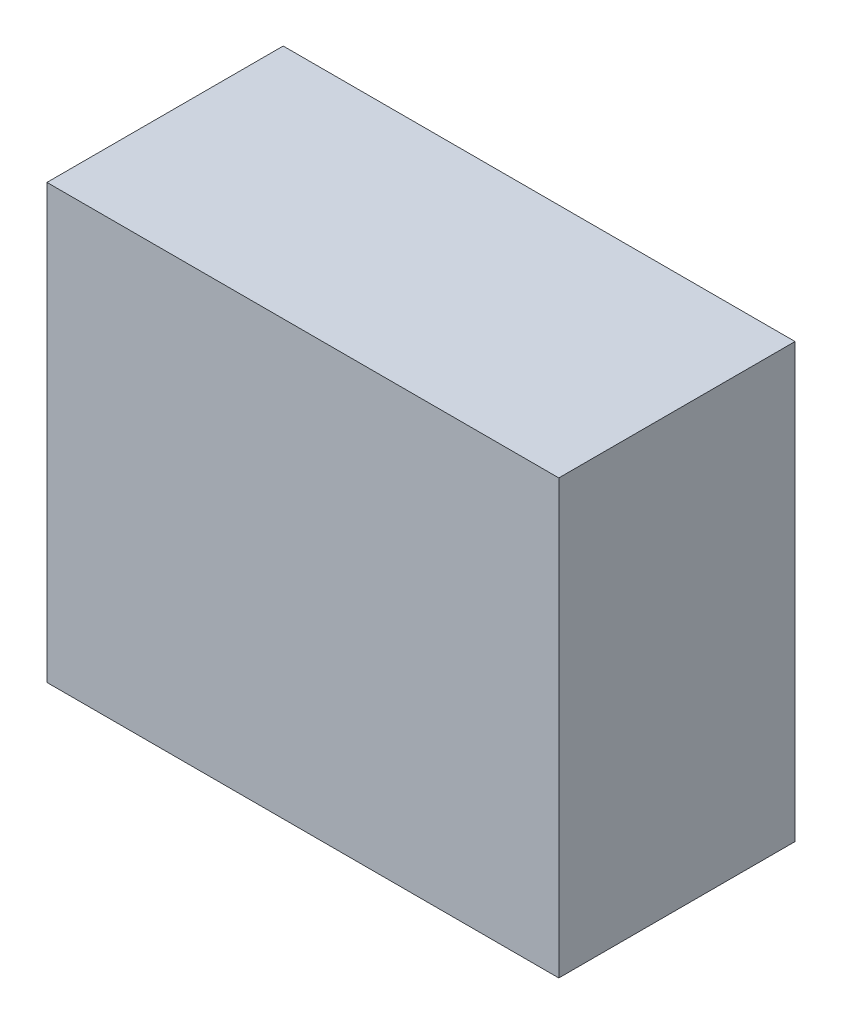
ISO-10303-21;
HEADER;
FILE_DESCRIPTION(('STEP AP214'),'2;1');
FILE_NAME('part.step','',(''),(''),'','','');
FILE_SCHEMA(('AUTOMOTIVE_DESIGN { 1 0 10303 214 1 1 1 1 }'));
ENDSEC;
DATA;
#1=APPLICATION_CONTEXT('core data for automotive mechanical design processes');
#2=APPLICATION_PROTOCOL_DEFINITION('international standard','automotive_design',2000,#1);
#3=PRODUCT_CONTEXT('',#1,'mechanical');
#4=PRODUCT('Part','Part','',(#3));
#5=PRODUCT_RELATED_PRODUCT_CATEGORY('part','',(#4));
#6=PRODUCT_DEFINITION_FORMATION('','',#4);
#7=PRODUCT_DEFINITION_CONTEXT('part definition',#1,'design');
#8=PRODUCT_DEFINITION('design','',#6,#7);
#9=PRODUCT_DEFINITION_SHAPE('','',#8);
#10=(LENGTH_UNIT() NAMED_UNIT(*) SI_UNIT(.MILLI.,.METRE.));
#11=(NAMED_UNIT(*) PLANE_ANGLE_UNIT() SI_UNIT($,.RADIAN.));
#12=(NAMED_UNIT(*) SI_UNIT($,.STERADIAN.) SOLID_ANGLE_UNIT());
#13=UNCERTAINTY_MEASURE_WITH_UNIT(LENGTH_MEASURE(1.E-05),#10,'distance_accuracy_value','');
#14=(GEOMETRIC_REPRESENTATION_CONTEXT(3) GLOBAL_UNCERTAINTY_ASSIGNED_CONTEXT((#13)) GLOBAL_UNIT_ASSIGNED_CONTEXT((#10,
#11,#12)) REPRESENTATION_CONTEXT('',''));
#15=CARTESIAN_POINT('',(0.,0.,0.));
#16=DIRECTION('',(0.,0.,1.));
#17=DIRECTION('',(1.,0.,0.));
#18=AXIS2_PLACEMENT_3D('',#15,#16,#17);
#19=CARTESIAN_POINT('',(6.5,5.,5.));
#20=DIRECTION('',(0.,0.,-1.));
#21=DIRECTION('',(-1.,0.,0.));
#22=AXIS2_PLACEMENT_3D('',#19,#20,#21);
#23=PLANE('',#22);
#24=DIRECTION('',(0.,1.,0.));
#25=VECTOR('',#24,1.);
#26=CARTESIAN_POINT('',(0.,5.,5.));
#27=LINE('',#26,#25);
#28=CARTESIAN_POINT('',(0.,5.,5.));
#29=VERTEX_POINT('',#28);
#30=CARTESIAN_POINT('',(0.,-0.5,5.));
#31=VERTEX_POINT('',#30);
#32=EDGE_CURVE('E55',#29,#31,#27,.F.);
#33=ORIENTED_EDGE('',*,*,#32,.T.);
#34=DIRECTION('',(1.,0.,0.));
#35=VECTOR('',#34,1.);
#36=CARTESIAN_POINT('',(0.,-0.5,5.));
#37=LINE('',#36,#35);
#38=CARTESIAN_POINT('',(6.5,-0.5,5.));
#39=VERTEX_POINT('',#38);
#40=EDGE_CURVE('E57',#31,#39,#37,.T.);
#41=ORIENTED_EDGE('',*,*,#40,.T.);
#42=DIRECTION('',(0.,1.,0.));
#43=VECTOR('',#42,1.);
#44=CARTESIAN_POINT('',(6.5,-0.5,5.));
#45=LINE('',#44,#43);
#46=CARTESIAN_POINT('',(6.5,5.,5.));
#47=VERTEX_POINT('',#46);
#48=EDGE_CURVE('E20',#39,#47,#45,.T.);
#49=ORIENTED_EDGE('',*,*,#48,.T.);
#50=DIRECTION('',(1.,0.,0.));
#51=VECTOR('',#50,1.);
#52=CARTESIAN_POINT('',(6.5,5.,5.));
#53=LINE('',#52,#51);
#54=EDGE_CURVE('E80',#47,#29,#53,.F.);
#55=ORIENTED_EDGE('',*,*,#54,.T.);
#56=EDGE_LOOP('',(#33,#41,#49,#55));
#57=FACE_BOUND('',#56,.T.);
#58=ADVANCED_FACE('F17',(#57),#23,.F.);
#59=CARTESIAN_POINT('',(6.5,-0.5,2.));
#60=DIRECTION('',(-1.,0.,0.));
#61=DIRECTION('',(0.,0.,1.));
#62=AXIS2_PLACEMENT_3D('',#59,#60,#61);
#63=PLANE('',#62);
#64=DIRECTION('',(0.,0.,-1.));
#65=VECTOR('',#64,1.);
#66=CARTESIAN_POINT('',(6.5,5.,2.));
#67=LINE('',#66,#65);
#68=CARTESIAN_POINT('',(6.5,5.,2.));
#69=VERTEX_POINT('',#68);
#70=EDGE_CURVE('E68',#69,#47,#67,.F.);
#71=ORIENTED_EDGE('',*,*,#70,.T.);
#72=ORIENTED_EDGE('',*,*,#48,.F.);
#73=DIRECTION('',(0.,0.,1.));
#74=VECTOR('',#73,1.);
#75=CARTESIAN_POINT('',(6.5,-0.5,2.));
#76=LINE('',#75,#74);
#77=CARTESIAN_POINT('',(6.5,-0.5,2.));
#78=VERTEX_POINT('',#77);
#79=EDGE_CURVE('E63',#39,#78,#76,.F.);
#80=ORIENTED_EDGE('',*,*,#79,.T.);
#81=DIRECTION('',(0.,1.,0.));
#82=VECTOR('',#81,1.);
#83=CARTESIAN_POINT('',(6.5,5.,2.));
#84=LINE('',#83,#82);
#85=EDGE_CURVE('E83',#69,#78,#84,.F.);
#86=ORIENTED_EDGE('',*,*,#85,.F.);
#87=EDGE_LOOP('',(#71,#72,#80,#86));
#88=FACE_BOUND('',#87,.T.);
#89=ADVANCED_FACE('F65',(#88),#63,.F.);
#90=CARTESIAN_POINT('',(0.,-0.5,2.));
#91=DIRECTION('',(0.,1.,0.));
#92=DIRECTION('',(0.,0.,1.));
#93=AXIS2_PLACEMENT_3D('',#90,#91,#92);
#94=PLANE('',#93);
#95=ORIENTED_EDGE('',*,*,#79,.F.);
#96=ORIENTED_EDGE('',*,*,#40,.F.);
#97=DIRECTION('',(0.,0.,-1.));
#98=VECTOR('',#97,1.);
#99=CARTESIAN_POINT('',(0.,-0.5,2.));
#100=LINE('',#99,#98);
#101=CARTESIAN_POINT('',(0.,-0.5,2.));
#102=VERTEX_POINT('',#101);
#103=EDGE_CURVE('E75',#31,#102,#100,.T.);
#104=ORIENTED_EDGE('',*,*,#103,.T.);
#105=DIRECTION('',(-1.,0.,0.));
#106=VECTOR('',#105,1.);
#107=CARTESIAN_POINT('',(6.5,-0.5,2.));
#108=LINE('',#107,#106);
#109=EDGE_CURVE('E72',#78,#102,#108,.T.);
#110=ORIENTED_EDGE('',*,*,#109,.F.);
#111=EDGE_LOOP('',(#95,#96,#104,#110));
#112=FACE_BOUND('',#111,.T.);
#113=ADVANCED_FACE('F70',(#112),#94,.F.);
#114=CARTESIAN_POINT('',(0.,5.,2.));
#115=DIRECTION('',(1.,0.,0.));
#116=DIRECTION('',(0.,0.,-1.));
#117=AXIS2_PLACEMENT_3D('',#114,#115,#116);
#118=PLANE('',#117);
#119=ORIENTED_EDGE('',*,*,#103,.F.);
#120=ORIENTED_EDGE('',*,*,#32,.F.);
#121=DIRECTION('',(0.,0.,-1.));
#122=VECTOR('',#121,1.);
#123=CARTESIAN_POINT('',(0.,5.,2.));
#124=LINE('',#123,#122);
#125=CARTESIAN_POINT('',(0.,5.,2.));
#126=VERTEX_POINT('',#125);
#127=EDGE_CURVE('E35',#29,#126,#124,.T.);
#128=ORIENTED_EDGE('',*,*,#127,.T.);
#129=DIRECTION('',(0.,1.,0.));
#130=VECTOR('',#129,1.);
#131=CARTESIAN_POINT('',(0.,5.,2.));
#132=LINE('',#131,#130);
#133=EDGE_CURVE('E26',#102,#126,#132,.T.);
#134=ORIENTED_EDGE('',*,*,#133,.F.);
#135=EDGE_LOOP('',(#119,#120,#128,#134));
#136=FACE_BOUND('',#135,.T.);
#137=ADVANCED_FACE('F89',(#136),#118,.F.);
#138=CARTESIAN_POINT('',(6.5,5.,2.));
#139=DIRECTION('',(0.,-1.,0.));
#140=DIRECTION('',(0.,0.,-1.));
#141=AXIS2_PLACEMENT_3D('',#138,#139,#140);
#142=PLANE('',#141);
#143=ORIENTED_EDGE('',*,*,#127,.F.);
#144=ORIENTED_EDGE('',*,*,#54,.F.);
#145=ORIENTED_EDGE('',*,*,#70,.F.);
#146=DIRECTION('',(-1.,0.,0.));
#147=VECTOR('',#146,1.);
#148=CARTESIAN_POINT('',(6.5,5.,2.));
#149=LINE('',#148,#147);
#150=EDGE_CURVE('E11',#126,#69,#149,.F.);
#151=ORIENTED_EDGE('',*,*,#150,.F.);
#152=EDGE_LOOP('',(#143,#144,#145,#151));
#153=FACE_BOUND('',#152,.T.);
#154=ADVANCED_FACE('F91',(#153),#142,.F.);
#155=CARTESIAN_POINT('',(6.5,5.,2.));
#156=DIRECTION('',(0.,0.,-1.));
#157=DIRECTION('',(-1.,0.,0.));
#158=AXIS2_PLACEMENT_3D('',#155,#156,#157);
#159=PLANE('',#158);
#160=ORIENTED_EDGE('',*,*,#133,.T.);
#161=ORIENTED_EDGE('',*,*,#150,.T.);
#162=ORIENTED_EDGE('',*,*,#85,.T.);
#163=ORIENTED_EDGE('',*,*,#109,.T.);
#164=EDGE_LOOP('',(#160,#161,#162,#163));
#165=FACE_BOUND('',#164,.T.);
#166=ADVANCED_FACE('F88',(#165),#159,.T.);
#167=CLOSED_SHELL('',(#58,#89,#113,#137,#154,#166));
#168=MANIFOLD_SOLID_BREP('B1',#167);
#169=ADVANCED_BREP_SHAPE_REPRESENTATION('',(#18,#168),#14);
#170=SHAPE_DEFINITION_REPRESENTATION(#9,#169);
ENDSEC;
END-ISO-10303-21;
